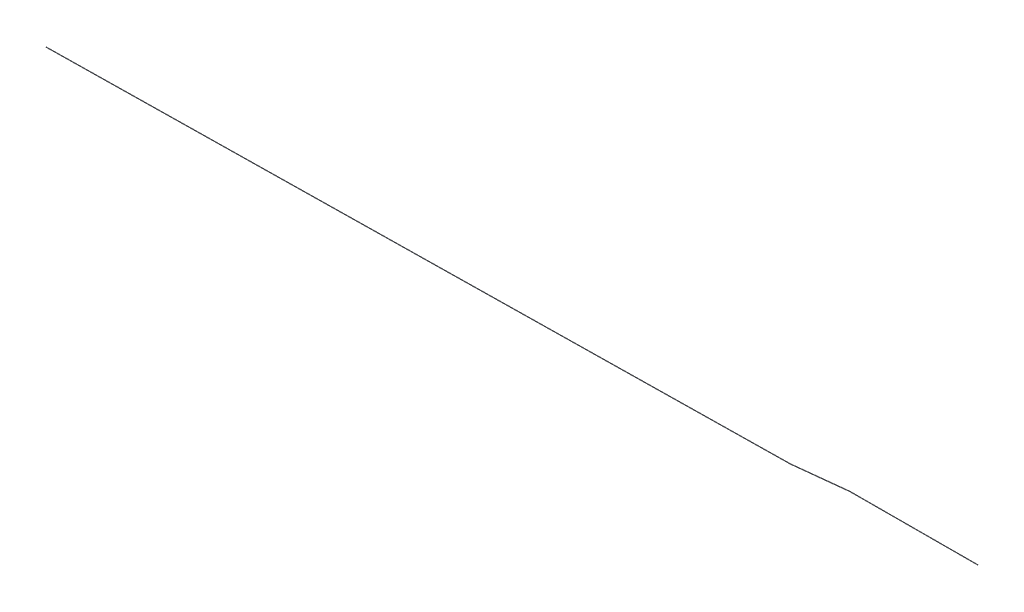
ISO-10303-21;
HEADER;
FILE_DESCRIPTION(('STEP AP214'),'2;1');
FILE_NAME('part.step','',(''),(''),'','','');
FILE_SCHEMA(('AUTOMOTIVE_DESIGN { 1 0 10303 214 1 1 1 1 }'));
ENDSEC;
DATA;
#1=APPLICATION_CONTEXT('core data for automotive mechanical design processes');
#2=APPLICATION_PROTOCOL_DEFINITION('international standard','automotive_design',2000,#1);
#3=PRODUCT_CONTEXT('',#1,'mechanical');
#4=PRODUCT('Part','Part','',(#3));
#5=PRODUCT_RELATED_PRODUCT_CATEGORY('part','',(#4));
#6=PRODUCT_DEFINITION_FORMATION('','',#4);
#7=PRODUCT_DEFINITION_CONTEXT('part definition',#1,'design');
#8=PRODUCT_DEFINITION('design','',#6,#7);
#9=PRODUCT_DEFINITION_SHAPE('','',#8);
#10=(LENGTH_UNIT() NAMED_UNIT(*) SI_UNIT(.MILLI.,.METRE.));
#11=(NAMED_UNIT(*) PLANE_ANGLE_UNIT() SI_UNIT($,.RADIAN.));
#12=(NAMED_UNIT(*) SI_UNIT($,.STERADIAN.) SOLID_ANGLE_UNIT());
#13=UNCERTAINTY_MEASURE_WITH_UNIT(LENGTH_MEASURE(1.E-05),#10,'distance_accuracy_value','');
#14=(GEOMETRIC_REPRESENTATION_CONTEXT(3) GLOBAL_UNCERTAINTY_ASSIGNED_CONTEXT((#13)) GLOBAL_UNIT_ASSIGNED_CONTEXT((#10,
#11,#12)) REPRESENTATION_CONTEXT('',''));
#15=CARTESIAN_POINT('',(0.,0.,0.));
#16=DIRECTION('',(0.,0.,1.));
#17=DIRECTION('',(1.,0.,0.));
#18=AXIS2_PLACEMENT_3D('',#15,#16,#17);
#19=CARTESIAN_POINT('',(176.313366101084,91.5888536850203,62.4133624890914));
#20=DIRECTION('',(-0.999996512111681,-0.000241918208220326,0.0026300646479331));
#21=DIRECTION('',(0.00263006472489461,0.,0.99999654137379));
#22=AXIS2_PLACEMENT_3D('',#19,#20,#21);
#23=PLANE('',#22);
#24=CARTESIAN_POINT('',(176.313366101084,91.5888536850203,62.4133624890914));
#25=DIRECTION('',(-0.999996512111681,-0.000241918208220326,0.0026300646479331));
#26=DIRECTION('',(0.00263006472489461,0.,0.99999654137379));
#27=AXIS2_PLACEMENT_3D('',#24,#25,#26);
#28=CIRCLE('',#27,0.125000000000001);
#29=CARTESIAN_POINT('',(176.313694859174,91.5888536850203,62.5383620567631));
#30=VERTEX_POINT('',#29);
#31=EDGE_CURVE('E58',#30,#30,#28,.T.);
#32=ORIENTED_EDGE('',*,*,#31,.F.);
#33=EDGE_LOOP('',(#32));
#34=FACE_BOUND('',#33,.T.);
#35=ADVANCED_FACE('F36',(#34),#23,.F.);
#36=CARTESIAN_POINT('',(-647.573672352059,82.0108575415894,68.3231965302792));
#37=DIRECTION('',(-0.999898823828365,-0.0142062259567934,0.000724741827657289));
#38=DIRECTION('',(0.000735440800555223,-0.000747908877486792,0.999999449879419));
#39=AXIS2_PLACEMENT_3D('',#36,#37,#38);
#40=PLANE('',#39);
#41=CARTESIAN_POINT('',(-647.573672352059,82.0108575415894,68.3231965302792));
#42=DIRECTION('',(-0.999898823828365,-0.0142062259567934,0.000724741827657289));
#43=DIRECTION('',(0.000735440800555223,-0.000747908877486792,0.999999449879419));
#44=AXIS2_PLACEMENT_3D('',#41,#42,#43);
#45=CIRCLE('',#44,0.125000000000001);
#46=CARTESIAN_POINT('',(-647.573580421959,82.0107640529797,68.4481964615141));
#47=VERTEX_POINT('',#46);
#48=EDGE_CURVE('E44',#47,#47,#45,.T.);
#49=ORIENTED_EDGE('',*,*,#48,.T.);
#50=EDGE_LOOP('',(#49));
#51=FACE_BOUND('',#50,.T.);
#52=ADVANCED_FACE('F105',(#51),#40,.T.);
#53=CARTESIAN_POINT('',(62.6027261107196,91.5613449147907,62.7124298665375));
#54=DIRECTION('',(0.999996512111682,0.000241918208220172,-0.0026300646479331));
#55=DIRECTION('',(-0.00263006472489461,0.,-0.99999654137379));
#56=AXIS2_PLACEMENT_3D('',#53,#54,#55);
#57=CYLINDRICAL_SURFACE('',#56,0.125000000000001);
#58=ORIENTED_EDGE('',*,*,#31,.T.);
#59=EDGE_LOOP('',(#58));
#60=FACE_BOUND('',#59,.T.);
#61=CARTESIAN_POINT('',(62.6027261107196,91.5613449147908,62.7124298665375));
#62=DIRECTION('',(-0.994242353991659,-0.00286289517305914,0.107116503678718));
#63=DIRECTION('',(0.107116478195604,0.000162674000702639,0.994246465236935));
#64=AXIS2_PLACEMENT_3D('',#61,#62,#63);
#65=CIRCLE('',#64,0.125000000000001);
#66=CARTESIAN_POINT('',(62.6161156704941,91.5613652490408,62.8367106746921));
#67=VERTEX_POINT('',#66);
#68=EDGE_CURVE('E39',#67,#67,#65,.T.);
#69=ORIENTED_EDGE('',*,*,#68,.F.);
#70=EDGE_LOOP('',(#69));
#71=FACE_BOUND('',#70,.T.);
#72=ADVANCED_FACE('F76',(#60,#71),#57,.T.);
#73=CARTESIAN_POINT('',(14.9817107812015,91.4242214313908,67.8429663431312));
#74=DIRECTION('',(0.994242353991659,0.00286289517305898,-0.107116503678718));
#75=DIRECTION('',(-0.107116942653888,0.,-0.994246428505772));
#76=AXIS2_PLACEMENT_3D('',#73,#74,#75);
#77=CYLINDRICAL_SURFACE('',#76,0.125000000000001);
#78=ORIENTED_EDGE('',*,*,#68,.T.);
#79=EDGE_LOOP('',(#78));
#80=FACE_BOUND('',#79,.T.);
#81=CARTESIAN_POINT('',(14.9817107812015,91.4242214313908,67.8429663431312));
#82=DIRECTION('',(-0.999898823828365,-0.0142062259567934,0.000724741827657289));
#83=DIRECTION('',(0.000735440800555223,-0.000747908877486792,0.999999449879419));
#84=AXIS2_PLACEMENT_3D('',#81,#82,#83);
#85=CIRCLE('',#84,0.125000000000001);
#86=CARTESIAN_POINT('',(14.9818027113016,91.4241279427811,67.9679662743661));
#87=VERTEX_POINT('',#86);
#88=EDGE_CURVE('E11',#87,#87,#85,.T.);
#89=ORIENTED_EDGE('',*,*,#88,.F.);
#90=EDGE_LOOP('',(#89));
#91=FACE_BOUND('',#90,.T.);
#92=ADVANCED_FACE('F72',(#80,#91),#77,.T.);
#93=CARTESIAN_POINT('',(-647.573672352059,82.0108575415894,68.3231965302792));
#94=DIRECTION('',(0.999898823828365,0.0142062259567933,-0.000724741827657253));
#95=DIRECTION('',(-0.0142062296877099,0.999899086427255,0.));
#96=AXIS2_PLACEMENT_3D('',#93,#94,#95);
#97=CYLINDRICAL_SURFACE('',#96,0.125000000000001);
#98=ORIENTED_EDGE('',*,*,#88,.T.);
#99=EDGE_LOOP('',(#98));
#100=FACE_BOUND('',#99,.T.);
#101=ORIENTED_EDGE('',*,*,#48,.F.);
#102=EDGE_LOOP('',(#101));
#103=FACE_BOUND('',#102,.T.);
#104=ADVANCED_FACE('F64',(#100,#103),#97,.T.);
#105=CLOSED_SHELL('',(#35,#52,#72,#92,#104));
#106=MANIFOLD_SOLID_BREP('B2',#105);
#107=ADVANCED_BREP_SHAPE_REPRESENTATION('',(#18,#106),#14);
#108=SHAPE_DEFINITION_REPRESENTATION(#9,#107);
ENDSEC;
END-ISO-10303-21;
